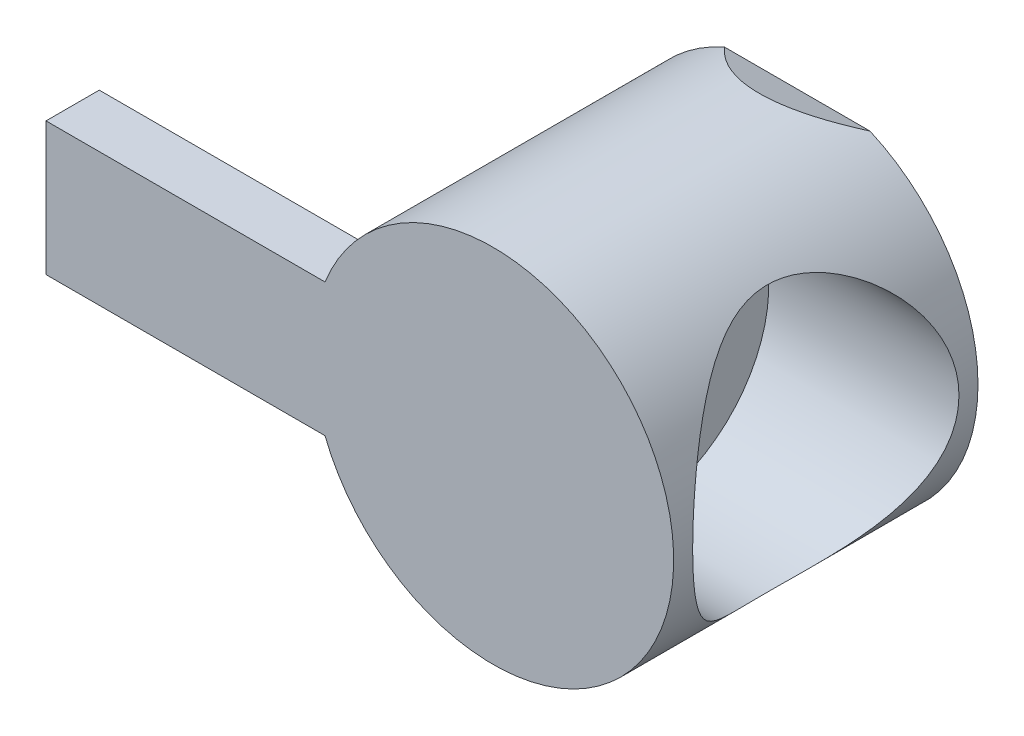
ISO-10303-21;
HEADER;
FILE_DESCRIPTION(('STEP AP214'),'2;1');
FILE_NAME('part.step','',(''),(''),'','','');
FILE_SCHEMA(('AUTOMOTIVE_DESIGN { 1 0 10303 214 1 1 1 1 }'));
ENDSEC;
DATA;
#1=APPLICATION_CONTEXT('core data for automotive mechanical design processes');
#2=APPLICATION_PROTOCOL_DEFINITION('international standard','automotive_design',2000,#1);
#3=PRODUCT_CONTEXT('',#1,'mechanical');
#4=PRODUCT('Part','Part','',(#3));
#5=PRODUCT_RELATED_PRODUCT_CATEGORY('part','',(#4));
#6=PRODUCT_DEFINITION_FORMATION('','',#4);
#7=PRODUCT_DEFINITION_CONTEXT('part definition',#1,'design');
#8=PRODUCT_DEFINITION('design','',#6,#7);
#9=PRODUCT_DEFINITION_SHAPE('','',#8);
#10=(LENGTH_UNIT() NAMED_UNIT(*) SI_UNIT(.MILLI.,.METRE.));
#11=(NAMED_UNIT(*) PLANE_ANGLE_UNIT() SI_UNIT($,.RADIAN.));
#12=(NAMED_UNIT(*) SI_UNIT($,.STERADIAN.) SOLID_ANGLE_UNIT());
#13=UNCERTAINTY_MEASURE_WITH_UNIT(LENGTH_MEASURE(1.E-05),#10,'distance_accuracy_value','');
#14=(GEOMETRIC_REPRESENTATION_CONTEXT(3) GLOBAL_UNCERTAINTY_ASSIGNED_CONTEXT((#13)) GLOBAL_UNIT_ASSIGNED_CONTEXT((#10,
#11,#12)) REPRESENTATION_CONTEXT('',''));
#15=CARTESIAN_POINT('',(0.,0.,0.));
#16=DIRECTION('',(0.,0.,1.));
#17=DIRECTION('',(1.,0.,0.));
#18=AXIS2_PLACEMENT_3D('',#15,#16,#17);
#19=CARTESIAN_POINT('',(-23.5,0.,-1.40000000000001));
#20=DIRECTION('',(-1.,0.,0.));
#21=DIRECTION('',(0.,0.,1.));
#22=AXIS2_PLACEMENT_3D('',#19,#20,#21);
#23=PLANE('',#22);
#24=DIRECTION('',(0.,0.,-1.));
#25=VECTOR('',#24,1.);
#26=CARTESIAN_POINT('',(-23.5,-3.5,0.));
#27=LINE('',#26,#25);
#28=CARTESIAN_POINT('',(-23.5,-3.5,0.));
#29=VERTEX_POINT('',#28);
#30=CARTESIAN_POINT('',(-23.5,-3.5,-2.80000000000001));
#31=VERTEX_POINT('',#30);
#32=EDGE_CURVE('E74',#29,#31,#27,.T.);
#33=ORIENTED_EDGE('',*,*,#32,.F.);
#34=DIRECTION('',(0.,1.,0.));
#35=VECTOR('',#34,1.);
#36=CARTESIAN_POINT('',(-23.5,0.,0.));
#37=LINE('',#36,#35);
#38=CARTESIAN_POINT('',(-23.5,3.5,0.));
#39=VERTEX_POINT('',#38);
#40=EDGE_CURVE('E70',#39,#29,#37,.F.);
#41=ORIENTED_EDGE('',*,*,#40,.F.);
#42=DIRECTION('',(0.,0.,1.));
#43=VECTOR('',#42,1.);
#44=CARTESIAN_POINT('',(-23.5,3.5,0.));
#45=LINE('',#44,#43);
#46=CARTESIAN_POINT('',(-23.5,3.5,-2.8));
#47=VERTEX_POINT('',#46);
#48=EDGE_CURVE('E118',#47,#39,#45,.T.);
#49=ORIENTED_EDGE('',*,*,#48,.F.);
#50=DIRECTION('',(0.,1.,0.));
#51=VECTOR('',#50,1.);
#52=CARTESIAN_POINT('',(-23.5,3.5,-2.8));
#53=LINE('',#52,#51);
#54=EDGE_CURVE('E109',#31,#47,#53,.T.);
#55=ORIENTED_EDGE('',*,*,#54,.F.);
#56=EDGE_LOOP('',(#33,#41,#49,#55));
#57=FACE_BOUND('',#56,.T.);
#58=ADVANCED_FACE('F16',(#57),#23,.T.);
#59=CARTESIAN_POINT('',(-0.499999999999997,-7.,-8.));
#60=DIRECTION('',(1.,0.,0.));
#61=DIRECTION('',(0.,0.,-1.));
#62=AXIS2_PLACEMENT_3D('',#59,#60,#61);
#63=PLANE('',#62);
#64=CARTESIAN_POINT('',(-0.499999999999997,0.,-8.));
#65=DIRECTION('',(-1.,0.,0.));
#66=DIRECTION('',(0.,0.,1.));
#67=AXIS2_PLACEMENT_3D('',#64,#65,#66);
#68=CIRCLE('',#67,4.);
#69=CARTESIAN_POINT('',(-0.499999999999997,0.,-4.));
#70=VERTEX_POINT('',#69);
#71=EDGE_CURVE('E89',#70,#70,#68,.F.);
#72=ORIENTED_EDGE('',*,*,#71,.F.);
#73=EDGE_LOOP('',(#72));
#74=FACE_BOUND('',#73,.T.);
#75=CARTESIAN_POINT('',(-0.499999999999997,0.,-8.));
#76=DIRECTION('',(-1.,0.,0.));
#77=DIRECTION('',(0.,0.,1.));
#78=AXIS2_PLACEMENT_3D('',#75,#76,#77);
#79=CIRCLE('',#78,7.);
#80=CARTESIAN_POINT('',(-0.499999999999997,0.,-0.999999999999996));
#81=VERTEX_POINT('',#80);
#82=EDGE_CURVE('E19',#81,#81,#79,.T.);
#83=ORIENTED_EDGE('',*,*,#82,.F.);
#84=EDGE_LOOP('',(#83));
#85=FACE_BOUND('',#84,.T.);
#86=ADVANCED_FACE('F181',(#74,#85),#63,.T.);
#87=CARTESIAN_POINT('',(-7.5,3.5,0.));
#88=DIRECTION('',(0.,1.,0.));
#89=DIRECTION('',(0.,0.,1.));
#90=AXIS2_PLACEMENT_3D('',#87,#88,#89);
#91=PLANE('',#90);
#92=ORIENTED_EDGE('',*,*,#48,.T.);
#93=DIRECTION('',(1.,0.,0.));
#94=VECTOR('',#93,1.);
#95=CARTESIAN_POINT('',(0.,3.5,0.));
#96=LINE('',#95,#94);
#97=CARTESIAN_POINT('',(-8.83176086632785,3.5,0.));
#98=VERTEX_POINT('',#97);
#99=EDGE_CURVE('E56',#98,#39,#96,.F.);
#100=ORIENTED_EDGE('',*,*,#99,.F.);
#101=DIRECTION('',(0.,0.,-1.));
#102=VECTOR('',#101,1.);
#103=CARTESIAN_POINT('',(-8.83176086632785,3.5,0.));
#104=LINE('',#103,#102);
#105=CARTESIAN_POINT('',(-8.83176086632785,3.5,-2.8));
#106=VERTEX_POINT('',#105);
#107=EDGE_CURVE('E87',#106,#98,#104,.F.);
#108=ORIENTED_EDGE('',*,*,#107,.F.);
#109=DIRECTION('',(-1.,0.,0.));
#110=VECTOR('',#109,1.);
#111=CARTESIAN_POINT('',(-7.5,3.5,-2.8));
#112=LINE('',#111,#110);
#113=EDGE_CURVE('E104',#47,#106,#112,.F.);
#114=ORIENTED_EDGE('',*,*,#113,.F.);
#115=EDGE_LOOP('',(#92,#100,#108,#114));
#116=FACE_BOUND('',#115,.T.);
#117=ADVANCED_FACE('F174',(#116),#91,.T.);
#118=CARTESIAN_POINT('',(0.,0.,0.));
#119=DIRECTION('',(0.,0.,1.));
#120=DIRECTION('',(1.,0.,0.));
#121=AXIS2_PLACEMENT_3D('',#118,#119,#120);
#122=PLANE('',#121);
#123=ORIENTED_EDGE('',*,*,#40,.T.);
#124=DIRECTION('',(1.,0.,0.));
#125=VECTOR('',#124,1.);
#126=CARTESIAN_POINT('',(-21.5,-3.5,0.));
#127=LINE('',#126,#125);
#128=CARTESIAN_POINT('',(-8.83176086632785,-3.5,0.));
#129=VERTEX_POINT('',#128);
#130=EDGE_CURVE('E62',#129,#29,#127,.F.);
#131=ORIENTED_EDGE('',*,*,#130,.F.);
#132=CARTESIAN_POINT('',(0.,0.,0.));
#133=DIRECTION('',(0.,0.,-1.));
#134=DIRECTION('',(-1.,0.,0.));
#135=AXIS2_PLACEMENT_3D('',#132,#133,#134);
#136=CIRCLE('',#135,9.5);
#137=EDGE_CURVE('E66',#98,#129,#136,.T.);
#138=ORIENTED_EDGE('',*,*,#137,.F.);
#139=ORIENTED_EDGE('',*,*,#99,.T.);
#140=EDGE_LOOP('',(#123,#131,#138,#139));
#141=FACE_BOUND('',#140,.T.);
#142=ADVANCED_FACE('F64',(#141),#122,.T.);
#143=CARTESIAN_POINT('',(-21.5,-3.5,0.));
#144=DIRECTION('',(0.,-1.,0.));
#145=DIRECTION('',(0.,0.,-1.));
#146=AXIS2_PLACEMENT_3D('',#143,#144,#145);
#147=PLANE('',#146);
#148=ORIENTED_EDGE('',*,*,#32,.T.);
#149=DIRECTION('',(-1.,0.,0.));
#150=VECTOR('',#149,1.);
#151=CARTESIAN_POINT('',(-7.5,-3.5,-2.8));
#152=LINE('',#151,#150);
#153=CARTESIAN_POINT('',(-8.83176086632785,-3.5,-2.8));
#154=VERTEX_POINT('',#153);
#155=EDGE_CURVE('E80',#154,#31,#152,.T.);
#156=ORIENTED_EDGE('',*,*,#155,.F.);
#157=DIRECTION('',(0.,0.,-1.));
#158=VECTOR('',#157,1.);
#159=CARTESIAN_POINT('',(-8.83176086632785,-3.5,0.));
#160=LINE('',#159,#158);
#161=EDGE_CURVE('E77',#129,#154,#160,.T.);
#162=ORIENTED_EDGE('',*,*,#161,.F.);
#163=ORIENTED_EDGE('',*,*,#130,.T.);
#164=EDGE_LOOP('',(#148,#156,#162,#163));
#165=FACE_BOUND('',#164,.T.);
#166=ADVANCED_FACE('F78',(#165),#147,.T.);
#167=CARTESIAN_POINT('',(-7.5,3.5,-2.8));
#168=DIRECTION('',(0.,0.,-1.));
#169=DIRECTION('',(-1.,0.,0.));
#170=AXIS2_PLACEMENT_3D('',#167,#168,#169);
#171=PLANE('',#170);
#172=ORIENTED_EDGE('',*,*,#54,.T.);
#173=ORIENTED_EDGE('',*,*,#113,.T.);
#174=CARTESIAN_POINT('',(0.,0.,-2.8));
#175=DIRECTION('',(0.,0.,-1.));
#176=DIRECTION('',(-1.,0.,0.));
#177=AXIS2_PLACEMENT_3D('',#174,#175,#176);
#178=CIRCLE('',#177,9.5);
#179=EDGE_CURVE('E84',#154,#106,#178,.T.);
#180=ORIENTED_EDGE('',*,*,#179,.F.);
#181=ORIENTED_EDGE('',*,*,#155,.T.);
#182=EDGE_LOOP('',(#172,#173,#180,#181));
#183=FACE_BOUND('',#182,.T.);
#184=ADVANCED_FACE('F170',(#183),#171,.T.);
#185=CARTESIAN_POINT('',(0.,-9.0983408237649,-15.));
#186=DIRECTION('',(0.,-0.92794483738581,-0.372717558975992));
#187=DIRECTION('',(0.,0.372717558975992,-0.92794483738581));
#188=AXIS2_PLACEMENT_3D('',#185,#186,#187);
#189=PLANE('',#188);
#190=CARTESIAN_POINT('',(0.,0.,-37.6518933515901));
#191=DIRECTION('',(0.,-0.92794483738581,-0.372717558975992));
#192=DIRECTION('',(0.,0.372717558975992,-0.92794483738581));
#193=AXIS2_PLACEMENT_3D('',#190,#191,#192);
#194=ELLIPSE('',#193,25.4884691402798,9.5);
#195=CARTESIAN_POINT('',(-3.82331378800098,-8.6966816475298,-16.));
#196=VERTEX_POINT('',#195);
#197=CARTESIAN_POINT('',(3.82331378800098,-8.6966816475298,-16.));
#198=VERTEX_POINT('',#197);
#199=EDGE_CURVE('E167',#196,#198,#194,.F.);
#200=ORIENTED_EDGE('',*,*,#199,.F.);
#201=DIRECTION('',(-1.,0.,0.));
#202=VECTOR('',#201,1.);
#203=CARTESIAN_POINT('',(9.50000000000001,-8.6966816475298,-16.));
#204=LINE('',#203,#202);
#205=EDGE_CURVE('E99',#198,#196,#204,.T.);
#206=ORIENTED_EDGE('',*,*,#205,.F.);
#207=EDGE_LOOP('',(#200,#206));
#208=FACE_BOUND('',#207,.T.);
#209=ADVANCED_FACE('F198',(#208),#189,.T.);
#210=CARTESIAN_POINT('',(-0.108255951926131,7.61675230686671,-18.6886709044859));
#211=DIRECTION('',(0.,0.92794483738581,-0.372717558975992));
#212=DIRECTION('',(0.,0.372717558975992,0.92794483738581));
#213=AXIS2_PLACEMENT_3D('',#210,#211,#212);
#214=PLANE('',#213);
#215=CARTESIAN_POINT('',(0.,0.,-37.6518933515902));
#216=DIRECTION('',(0.,0.92794483738581,-0.372717558975992));
#217=DIRECTION('',(0.,-0.372717558975992,-0.92794483738581));
#218=AXIS2_PLACEMENT_3D('',#215,#216,#217);
#219=ELLIPSE('',#218,25.4884691402798,9.5);
#220=CARTESIAN_POINT('',(3.82331378800099,8.6966816475298,-16.));
#221=VERTEX_POINT('',#220);
#222=CARTESIAN_POINT('',(-3.82331378800098,8.6966816475298,-16.));
#223=VERTEX_POINT('',#222);
#224=EDGE_CURVE('E162',#221,#223,#219,.F.);
#225=ORIENTED_EDGE('',*,*,#224,.F.);
#226=DIRECTION('',(-1.,0.,0.));
#227=VECTOR('',#226,1.);
#228=CARTESIAN_POINT('',(9.50000000000001,8.6966816475298,-16.));
#229=LINE('',#228,#227);
#230=EDGE_CURVE('E33',#223,#221,#229,.F.);
#231=ORIENTED_EDGE('',*,*,#230,.F.);
#232=EDGE_LOOP('',(#225,#231));
#233=FACE_BOUND('',#232,.T.);
#234=ADVANCED_FACE('F201',(#233),#214,.T.);
#235=CARTESIAN_POINT('',(9.50000000000001,0.,-16.));
#236=DIRECTION('',(0.,0.,-1.));
#237=DIRECTION('',(-1.,0.,0.));
#238=AXIS2_PLACEMENT_3D('',#235,#236,#237);
#239=PLANE('',#238);
#240=ORIENTED_EDGE('',*,*,#230,.T.);
#241=CARTESIAN_POINT('',(0.,0.,-16.));
#242=DIRECTION('',(0.,0.,-1.));
#243=DIRECTION('',(-1.,0.,0.));
#244=AXIS2_PLACEMENT_3D('',#241,#242,#243);
#245=CIRCLE('',#244,9.5);
#246=EDGE_CURVE('E165',#198,#221,#245,.F.);
#247=ORIENTED_EDGE('',*,*,#246,.F.);
#248=ORIENTED_EDGE('',*,*,#205,.T.);
#249=CARTESIAN_POINT('',(0.,0.,-16.));
#250=DIRECTION('',(0.,0.,-1.));
#251=DIRECTION('',(-1.,0.,0.));
#252=AXIS2_PLACEMENT_3D('',#249,#250,#251);
#253=CIRCLE('',#252,9.5);
#254=EDGE_CURVE('E164',#223,#196,#253,.F.);
#255=ORIENTED_EDGE('',*,*,#254,.F.);
#256=EDGE_LOOP('',(#240,#247,#248,#255));
#257=FACE_BOUND('',#256,.T.);
#258=ADVANCED_FACE('F205',(#257),#239,.T.);
#259=CARTESIAN_POINT('',(9.50000000000001,0.,-8.));
#260=DIRECTION('',(-1.,0.,0.));
#261=DIRECTION('',(0.,0.,1.));
#262=AXIS2_PLACEMENT_3D('',#259,#260,#261);
#263=CYLINDRICAL_SURFACE('',#262,7.);
#264=ORIENTED_EDGE('',*,*,#82,.T.);
#265=EDGE_LOOP('',(#264));
#266=FACE_BOUND('',#265,.T.);
#267=CARTESIAN_POINT('',(9.5,0.,-15.));
#268=CARTESIAN_POINT('',(9.49999955541205,-0.171776685952553,-14.9999995379097));
#269=CARTESIAN_POINT('',(9.49533098908795,-0.343560225193648,-14.9936674467285));
#270=CARTESIAN_POINT('',(9.47676656087095,-0.685767013978319,-14.9684414714967));
#271=CARTESIAN_POINT('',(9.46286666358579,-0.856189635622143,-14.9495420937666));
#272=CARTESIAN_POINT('',(9.42614477075101,-1.19448027730661,-14.8994561720474));
#273=CARTESIAN_POINT('',(9.40331045412692,-1.36234443550678,-14.8682526594889));
#274=CARTESIAN_POINT('',(9.34923642147448,-1.69412177418581,-14.7940317146752));
#275=CARTESIAN_POINT('',(9.31799303174897,-1.85803319363687,-14.7510091188109));
#276=CARTESIAN_POINT('',(9.24799919952023,-2.17977978031129,-14.6540670672471));
#277=CARTESIAN_POINT('',(9.20929698937563,-2.33764656863681,-14.6002175319022));
#278=CARTESIAN_POINT('',(9.12502997386116,-2.64757708116554,-14.4821196135556));
#279=CARTESIAN_POINT('',(9.07946246255211,-2.79963848744044,-14.4178671295121));
#280=CARTESIAN_POINT('',(8.93375835423318,-3.24586369811695,-14.2106167564135));
#281=CARTESIAN_POINT('',(8.82453680001396,-3.53043821689032,-14.0530124893339));
#282=CARTESIAN_POINT('',(8.57825760516843,-4.09475115131068,-13.6882565565468));
#283=CARTESIAN_POINT('',(8.43956658164152,-4.37165864095569,-13.4778886648323));
#284=CARTESIAN_POINT('',(8.15091482841139,-4.88879093732242,-13.0218291370732));
#285=CARTESIAN_POINT('',(8.00093707508744,-5.12895860571657,-12.7760836103484));
#286=CARTESIAN_POINT('',(7.76049967158025,-5.48181424616637,-12.3579415308006));
#287=CARTESIAN_POINT('',(7.67032010942563,-5.60696990323276,-12.1957098019707));
#288=CARTESIAN_POINT('',(7.49198173465386,-5.84312192087893,-11.8600581456795));
#289=CARTESIAN_POINT('',(7.40382351786428,-5.95411414945518,-11.6866349753719));
#290=CARTESIAN_POINT('',(7.23242362575897,-6.16117658422522,-11.3290425066135));
#291=CARTESIAN_POINT('',(7.14917671636972,-6.25726286073934,-11.1448850798921));
#292=CARTESIAN_POINT('',(6.99079488630454,-6.43372619017791,-10.7660198309281));
#293=CARTESIAN_POINT('',(6.91565541664659,-6.51411207312527,-10.5713180180921));
#294=CARTESIAN_POINT('',(6.75445495057007,-6.68168937246028,-10.1058150140408));
#295=CARTESIAN_POINT('',(6.67288937491812,-6.7624720984525,-9.83099179050707));
#296=CARTESIAN_POINT('',(6.57371545179302,-6.85845271679183,-9.40803028557168));
#297=CARTESIAN_POINT('',(6.54452964476944,-6.88623891682234,-9.26533732895986));
#298=CARTESIAN_POINT('',(6.49495803127038,-6.93301436118631,-8.97703616186756));
#299=CARTESIAN_POINT('',(6.47456778607314,-6.95200804306041,-8.83142946073562));
#300=CARTESIAN_POINT('',(6.44335448167087,-6.98094872877254,-8.53704310231851));
#301=CARTESIAN_POINT('',(6.43261322697401,-6.99081839898816,-8.38824706610708));
#302=CARTESIAN_POINT('',(6.42151697724789,-7.00101267212038,-8.08994042638532));
#303=CARTESIAN_POINT('',(6.42116154926355,-7.00133767292664,-7.94042985292186));
#304=CARTESIAN_POINT('',(6.43085789106656,-6.99243223741762,-7.64195345069195));
#305=CARTESIAN_POINT('',(6.4409155034946,-6.98319643664374,-7.49298797486146));
#306=CARTESIAN_POINT('',(6.47094998819331,-6.95537341601778,-7.19694696395328));
#307=CARTESIAN_POINT('',(6.49092795496829,-6.9367851643147,-7.04987163925158));
#308=CARTESIAN_POINT('',(6.54244989420852,-6.8882310628938,-6.74351062107689));
#309=CARTESIAN_POINT('',(6.57498150538566,-6.85728212605807,-6.58454794134433));
#310=CARTESIAN_POINT('',(6.64948330997911,-6.78506116073618,-6.27117635874643));
#311=CARTESIAN_POINT('',(6.69145981128797,-6.74378223115349,-6.11677057758291));
#312=CARTESIAN_POINT('',(6.78322056918064,-6.65147770047985,-5.81297003630694));
#313=CARTESIAN_POINT('',(6.83301948543713,-6.60043375922959,-5.66358533732154));
#314=CARTESIAN_POINT('',(6.93868686353358,-6.48926082247947,-5.37054155145404));
#315=CARTESIAN_POINT('',(6.9945537026046,-6.42913425431028,-5.22688094773313));
#316=CARTESIAN_POINT('',(7.13163878833073,-6.27722782732685,-4.8950727394109));
#317=CARTESIAN_POINT('',(7.21478130229932,-6.18181548157259,-4.70937668568039));
#318=CARTESIAN_POINT('',(7.38614645460775,-5.97601774061044,-4.34893105987983));
#319=CARTESIAN_POINT('',(7.47437077848852,-5.86562736082084,-4.17418516036361));
#320=CARTESIAN_POINT('',(7.65314642626286,-5.63038165286863,-3.83570991029862));
#321=CARTESIAN_POINT('',(7.74369983406161,-5.50551299348858,-3.67199093583184));
#322=CARTESIAN_POINT('',(7.92457711931574,-5.24181678255556,-3.35611390836703));
#323=CARTESIAN_POINT('',(8.0149010226231,-5.10299088178997,-3.20395449189532));
#324=CARTESIAN_POINT('',(8.19443723561548,-4.80949416448075,-2.9095572750946));
#325=CARTESIAN_POINT('',(8.28361271965059,-4.6546174339426,-2.76750188573861));
#326=CARTESIAN_POINT('',(8.45726031506847,-4.33110290650534,-2.49672473915292));
#327=CARTESIAN_POINT('',(8.54173188426548,-4.16246352878738,-2.36800451750505));
#328=CARTESIAN_POINT('',(8.70369281598265,-3.81220430302919,-2.12527253028348));
#329=CARTESIAN_POINT('',(8.7811932512488,-3.63060589217282,-2.01123731048931));
#330=CARTESIAN_POINT('',(8.92724463591068,-3.25497524730534,-1.7990632508854));
#331=CARTESIAN_POINT('',(8.99579918023937,-3.06094805485953,-1.7009180217954));
#332=CARTESIAN_POINT('',(9.10583426828904,-2.71258675994345,-1.54489046885185));
#333=CARTESIAN_POINT('',(9.14976026757035,-2.56075245849196,-1.48312381115819));
#334=CARTESIAN_POINT('',(9.23072281936376,-2.25150704185519,-1.36993135333547));
#335=CARTESIAN_POINT('',(9.26776091235204,-2.09409718303787,-1.31850324078802));
#336=CARTESIAN_POINT('',(9.33415539124307,-1.77484452477982,-1.22670987236036));
#337=CARTESIAN_POINT('',(9.36352686759235,-1.61301113703341,-1.18632287635896));
#338=CARTESIAN_POINT('',(9.41405304054827,-1.28569422979342,-1.11705318904569));
#339=CARTESIAN_POINT('',(9.43521098910392,-1.12021218237982,-1.08816594456784));
#340=CARTESIAN_POINT('',(9.46790733508565,-0.796087809469865,-1.04360117423619));
#341=CARTESIAN_POINT('',(9.4799187532499,-0.637582505338162,-1.02727356284332));
#342=CARTESIAN_POINT('',(9.49596619231267,-0.319386948066158,-1.00547153625326));
#343=CARTESIAN_POINT('',(9.50000041332216,-0.15969643566463,-0.999999570406321));
#344=CARTESIAN_POINT('',(9.49999955541205,0.171776685952554,-1.00000046209032));
#345=CARTESIAN_POINT('',(9.49533098908795,0.343560225193649,-1.00633255327146));
#346=CARTESIAN_POINT('',(9.47676656087095,0.685767013978319,-1.03155852850331));
#347=CARTESIAN_POINT('',(9.46286666358579,0.856189635622142,-1.05045790623339));
#348=CARTESIAN_POINT('',(9.42614477075101,1.19448027730661,-1.10054382795259));
#349=CARTESIAN_POINT('',(9.40331045412692,1.36234443550678,-1.13174734051107));
#350=CARTESIAN_POINT('',(9.34923642147448,1.69412177418581,-1.20596828532482));
#351=CARTESIAN_POINT('',(9.31799303174897,1.85803319363687,-1.24899088118914));
#352=CARTESIAN_POINT('',(9.24799919952023,2.17977978031129,-1.34593293275293));
#353=CARTESIAN_POINT('',(9.20929698937563,2.33764656863681,-1.39978246809779));
#354=CARTESIAN_POINT('',(9.12502997386116,2.64757708116554,-1.51788038644444));
#355=CARTESIAN_POINT('',(9.07946246255211,2.79963848744045,-1.58213287048791));
#356=CARTESIAN_POINT('',(8.93375835423318,3.24586369811696,-1.78938324358651));
#357=CARTESIAN_POINT('',(8.82453680001396,3.53043821689032,-1.94698751066605));
#358=CARTESIAN_POINT('',(8.57825760516843,4.09475115131068,-2.31174344345321));
#359=CARTESIAN_POINT('',(8.43956658164152,4.37165864095569,-2.52211133516767));
#360=CARTESIAN_POINT('',(8.15091482841139,4.88879093732242,-2.97817086292678));
#361=CARTESIAN_POINT('',(8.00093707508744,5.12895860571657,-3.22391638965163));
#362=CARTESIAN_POINT('',(7.76049967158025,5.48181424616637,-3.64205846919939));
#363=CARTESIAN_POINT('',(7.67032010942563,5.60696990323276,-3.80429019802929));
#364=CARTESIAN_POINT('',(7.49198173465386,5.84312192087893,-4.13994185432051));
#365=CARTESIAN_POINT('',(7.40382351786428,5.95411414945518,-4.31336502462811));
#366=CARTESIAN_POINT('',(7.23242362575897,6.16117658422522,-4.6709574933865));
#367=CARTESIAN_POINT('',(7.14917671636972,6.25726286073933,-4.85511492010789));
#368=CARTESIAN_POINT('',(6.99079488630454,6.43372619017791,-5.23398016907187));
#369=CARTESIAN_POINT('',(6.91565541664659,6.51411207312527,-5.42868198190792));
#370=CARTESIAN_POINT('',(6.75445495057007,6.68168937246028,-5.89418498595919));
#371=CARTESIAN_POINT('',(6.67288937491812,6.7624720984525,-6.16900820949293));
#372=CARTESIAN_POINT('',(6.57371545179302,6.85845271679183,-6.59196971442833));
#373=CARTESIAN_POINT('',(6.54452964476944,6.88623891682234,-6.73466267104014));
#374=CARTESIAN_POINT('',(6.49495803127038,6.93301436118631,-7.02296383813244));
#375=CARTESIAN_POINT('',(6.47456778607314,6.95200804306041,-7.16857053926438));
#376=CARTESIAN_POINT('',(6.44335448167088,6.98094872877254,-7.46295689768149));
#377=CARTESIAN_POINT('',(6.43261322697401,6.99081839898816,-7.61175293389292));
#378=CARTESIAN_POINT('',(6.42151697724789,7.00101267212038,-7.91005957361468));
#379=CARTESIAN_POINT('',(6.42116154926355,7.00133767292664,-8.05957014707814));
#380=CARTESIAN_POINT('',(6.43085789106656,6.99243223741762,-8.35804654930805));
#381=CARTESIAN_POINT('',(6.4409155034946,6.98319643664374,-8.50701202513853));
#382=CARTESIAN_POINT('',(6.47094998819332,6.95537341601778,-8.80305303604672));
#383=CARTESIAN_POINT('',(6.49092795496829,6.9367851643147,-8.95012836074842));
#384=CARTESIAN_POINT('',(6.54244989420852,6.8882310628938,-9.25648937892311));
#385=CARTESIAN_POINT('',(6.57498150538566,6.85728212605807,-9.41545205865567));
#386=CARTESIAN_POINT('',(6.64948330997911,6.78506116073618,-9.72882364125357));
#387=CARTESIAN_POINT('',(6.69145981128797,6.74378223115349,-9.8832294224171));
#388=CARTESIAN_POINT('',(6.78322056918064,6.65147770047984,-10.1870299636931));
#389=CARTESIAN_POINT('',(6.83301948543713,6.60043375922959,-10.3364146626785));
#390=CARTESIAN_POINT('',(6.93868686353358,6.48926082247947,-10.629458448546));
#391=CARTESIAN_POINT('',(6.9945537026046,6.42913425431028,-10.7731190522669));
#392=CARTESIAN_POINT('',(7.13163878833073,6.27722782732685,-11.1049272605891));
#393=CARTESIAN_POINT('',(7.21478130229932,6.18181548157258,-11.2906233143196));
#394=CARTESIAN_POINT('',(7.38614645460775,5.97601774061043,-11.6510689401202));
#395=CARTESIAN_POINT('',(7.47437077848852,5.86562736082084,-11.8258148396364));
#396=CARTESIAN_POINT('',(7.65314642626286,5.63038165286862,-12.1642900897014));
#397=CARTESIAN_POINT('',(7.74369983406161,5.50551299348857,-12.3280090641682));
#398=CARTESIAN_POINT('',(7.92457711931575,5.24181678255555,-12.643886091633));
#399=CARTESIAN_POINT('',(8.01490102262311,5.10299088178996,-12.7960455081047));
#400=CARTESIAN_POINT('',(8.19443723561549,4.80949416448074,-13.0904427249054));
#401=CARTESIAN_POINT('',(8.2836127196506,4.65461743394259,-13.2324981142614));
#402=CARTESIAN_POINT('',(8.45726031506847,4.33110290650532,-13.5032752608471));
#403=CARTESIAN_POINT('',(8.54173188426548,4.16246352878737,-13.631995482495));
#404=CARTESIAN_POINT('',(8.70369281598266,3.81220430302918,-13.8747274697165));
#405=CARTESIAN_POINT('',(8.78119325124881,3.6306058921728,-13.9887626895107));
#406=CARTESIAN_POINT('',(8.92724463591069,3.25497524730533,-14.2009367491146));
#407=CARTESIAN_POINT('',(8.99579918023937,3.06094805485951,-14.2990819782046));
#408=CARTESIAN_POINT('',(9.10583426828904,2.71258675994344,-14.4551095311482));
#409=CARTESIAN_POINT('',(9.14976026757035,2.56075245849195,-14.5168761888418));
#410=CARTESIAN_POINT('',(9.23072281936377,2.25150704185518,-14.6300686466645));
#411=CARTESIAN_POINT('',(9.26776091235204,2.09409718303786,-14.681496759212));
#412=CARTESIAN_POINT('',(9.33415539124308,1.7748445247798,-14.7732901276396));
#413=CARTESIAN_POINT('',(9.36352686759235,1.6130111370334,-14.813677123641));
#414=CARTESIAN_POINT('',(9.41405304054827,1.2856942297934,-14.8829468109543));
#415=CARTESIAN_POINT('',(9.43521098910392,1.12021218237981,-14.9118340554322));
#416=CARTESIAN_POINT('',(9.46790733508566,0.796087809469852,-14.9563988257638));
#417=CARTESIAN_POINT('',(9.47991875324991,0.637582505338151,-14.9727264371567));
#418=CARTESIAN_POINT('',(9.49596619231267,0.319386948066152,-14.9945284637467));
#419=CARTESIAN_POINT('',(9.50000041332216,0.159696435664627,-15.0000004295937));
#420=CARTESIAN_POINT('',(9.5,0.,-15.));
#421=B_SPLINE_CURVE_WITH_KNOTS('',3,(#267,#268,#269,#270,#271,#272,#273,#274,#275,#276,#277,
#278,#279,#280,#281,#282,#283,#284,#285,#286,#287,#288,#289,#290,#291,#292,#293,#294,#295,#296,
#297,#298,#299,#300,#301,#302,#303,#304,#305,#306,#307,#308,#309,#310,#311,#312,#313,#314,#315,
#316,#317,#318,#319,#320,#321,#322,#323,#324,#325,#326,#327,#328,#329,#330,#331,#332,#333,#334,
#335,#336,#337,#338,#339,#340,#341,#342,#343,#344,#345,#346,#347,#348,#349,#350,#351,#352,#353,
#354,#355,#356,#357,#358,#359,#360,#361,#362,#363,#364,#365,#366,#367,#368,#369,#370,#371,#372,
#373,#374,#375,#376,#377,#378,#379,#380,#381,#382,#383,#384,#385,#386,#387,#388,#389,#390,#391,
#392,#393,#394,#395,#396,#397,#398,#399,#400,#401,#402,#403,#404,#405,#406,#407,#408,#409,#410,
#411,#412,#413,#414,#415,#416,#417,#418,#419,#420),.UNSPECIFIED.,.T.,.F.,(4,2,2,2,2,2,2,2,2,2,2,
2,2,2,2,2,2,2,2,2,2,2,2,2,2,2,2,2,2,2,2,2,2,2,2,2,2,2,2,2,2,2,2,2,2,2,2,2,2,2,2,2,2,2,2,2,2,2,2,
2,2,2,2,2,2,2,2,2,2,2,2,2,2,2,2,2,4),(0.,0.515163605013197,1.03055255746482,1.54665478009514,
2.06298284087337,2.57607778227243,3.08937549024409,4.11479706697071,5.23415084878313,
6.35522814561899,7.02619557357636,7.69735830255475,8.36779233588973,9.0378482192703,
9.92757547003859,10.3719471634058,10.816094339396,11.2639724148655,11.7118318195669,
12.1599426494335,12.6081029299775,13.1029236514249,13.598075831437,14.0941672774528,
14.5901263768995,15.2633476684878,15.9367935553124,16.6108645327088,17.2848558782,
17.9689268779854,18.6530765631033,19.3361196330275,20.0188873691962,20.527492653794,
21.0359840519631,21.5434668912918,22.0507485995579,22.5295751346067,23.0085096946056,
23.5236732996188,24.0390622520704,24.5551644747007,25.071492535479,25.584587476878,
26.0978851848497,27.1233067615763,28.2426605433887,29.3637378402246,30.034705268182,
30.7058679971604,31.3763020304953,32.0463579138759,32.9360851646442,33.3804568580114,
33.8246040340016,34.2724821094711,34.7203415141725,35.1684523440391,35.6166126245831,
36.1114333460305,36.6065855260426,37.1026769720584,37.5986360715051,38.2718573630933,
38.945303249918,39.6193742273144,40.2933655728056,40.977436572591,41.6615862577089,
42.3446293276331,43.0273970638018,43.5360023483996,44.0444937465687,44.5519765858974,
45.0592582941634,45.5380848292123,46.0170193892112),.UNSPECIFIED.);
#422=CARTESIAN_POINT('',(9.5,0.,-15.));
#423=VERTEX_POINT('',#422);
#424=EDGE_CURVE('E25',#423,#423,#421,.T.);
#425=ORIENTED_EDGE('',*,*,#424,.F.);
#426=EDGE_LOOP('',(#425));
#427=FACE_BOUND('',#426,.T.);
#428=ADVANCED_FACE('F152',(#266,#427),#263,.F.);
#429=CARTESIAN_POINT('',(9.50000000000001,0.,-8.));
#430=DIRECTION('',(-1.,0.,0.));
#431=DIRECTION('',(0.,0.,1.));
#432=AXIS2_PLACEMENT_3D('',#429,#430,#431);
#433=CYLINDRICAL_SURFACE('',#432,4.);
#434=CARTESIAN_POINT('',(-8.61684396980705,4.,-8.));
#435=CARTESIAN_POINT('',(-8.61684479291634,3.99999920365226,-7.89339588951191));
#436=CARTESIAN_POINT('',(-8.61882923618132,3.9957319358542,-7.78675494811101));
#437=CARTESIAN_POINT('',(-8.62670095753731,3.97870775218113,-7.57425234767577));
#438=CARTESIAN_POINT('',(-8.63259074890548,3.96594536927521,-7.46839123488566));
#439=CARTESIAN_POINT('',(-8.64809004641728,3.93203356564338,-7.25805909420674));
#440=CARTESIAN_POINT('',(-8.65770736697029,3.91086652305503,-7.15359146674129));
#441=CARTESIAN_POINT('',(-8.6803354198555,3.860379986894,-6.94700660151014));
#442=CARTESIAN_POINT('',(-8.69334758173029,3.8310570585935,-6.84489037366222));
#443=CARTESIAN_POINT('',(-8.73674622007323,3.7315599849548,-6.54402847681404));
#444=CARTESIAN_POINT('',(-8.77158383752974,3.64967476491844,-6.34965608494503));
#445=CARTESIAN_POINT('',(-8.8491231047003,3.45741232788934,-5.97756390364931));
#446=CARTESIAN_POINT('',(-8.8918230094151,3.34704143098506,-5.7998404322496));
#447=CARTESIAN_POINT('',(-8.98331887532201,3.09340545265793,-5.45455275976188));
#448=CARTESIAN_POINT('',(-9.0323243701199,2.94861066888091,-5.28816517116338));
#449=CARTESIAN_POINT('',(-9.12918799654512,2.63345602204265,-4.98116894420088));
#450=CARTESIAN_POINT('',(-9.17704567399664,2.46308622671577,-4.84057036855449));
#451=CARTESIAN_POINT('',(-9.26877681609602,2.09231676497945,-4.58307831936011));
#452=CARTESIAN_POINT('',(-9.31237856691952,1.89091878265369,-4.46751658857194));
#453=CARTESIAN_POINT('',(-9.38811444393872,1.4693730575349,-4.27242564263145));
#454=CARTESIAN_POINT('',(-9.42025376150082,1.24923385879032,-4.19288011123606));
#455=CARTESIAN_POINT('',(-9.46795722737466,0.808831057041757,-4.07636813025215));
#456=CARTESIAN_POINT('',(-9.48430966668667,0.589192572355979,-4.0373682087497));
#457=CARTESIAN_POINT('',(-9.50146415645256,0.145921296137905,-3.99647791119913));
#458=CARTESIAN_POINT('',(-9.50227265579288,-0.0777098003891295,-3.99457214548393));
#459=CARTESIAN_POINT('',(-9.48870803605992,-0.507809014322279,-4.02687201870989));
#460=CARTESIAN_POINT('',(-9.47527492001272,-0.714480298467526,-4.05884167427961));
#461=CARTESIAN_POINT('',(-9.43603370637273,-1.11920616443698,-4.15414388128753));
#462=CARTESIAN_POINT('',(-9.41022469558179,-1.31726010922456,-4.21747874712743));
#463=CARTESIAN_POINT('',(-9.34822412974687,-1.70277425779943,-4.37445787547147));
#464=CARTESIAN_POINT('',(-9.31187993215786,-1.89002630779711,-4.46855054659769));
#465=CARTESIAN_POINT('',(-9.23235185267789,-2.24657465770714,-4.68392928340789));
#466=CARTESIAN_POINT('',(-9.18916553920334,-2.4158645382903,-4.80522502303991));
#467=CARTESIAN_POINT('',(-9.09661565977341,-2.74459541942161,-5.08168462483474));
#468=CARTESIAN_POINT('',(-9.04703120212881,-2.90245769431404,-5.23865435362879));
#469=CARTESIAN_POINT('',(-8.94958496430327,-3.19030905144212,-5.57692731834381));
#470=CARTESIAN_POINT('',(-8.90172388368923,-3.32028691843321,-5.7582402977487));
#471=CARTESIAN_POINT('',(-8.81154640450858,-3.55285473738947,-6.14786429218683));
#472=CARTESIAN_POINT('',(-8.76947528387452,-3.65435735480679,-6.35688602183361));
#473=CARTESIAN_POINT('',(-8.69857730626177,-3.82007496880753,-6.79129673851623));
#474=CARTESIAN_POINT('',(-8.66974074928303,-3.88431728369774,-7.01667359763221));
#475=CARTESIAN_POINT('',(-8.63099704573982,-3.9696294380598,-7.46156479271675));
#476=CARTESIAN_POINT('',(-8.61996848160524,-3.993263518851,-7.68048795833547));
#477=CARTESIAN_POINT('',(-8.61488120321362,-4.0042333597211,-8.11940280460085));
#478=CARTESIAN_POINT('',(-8.62081640806785,-3.99158212674786,-8.33939407414844));
#479=CARTESIAN_POINT('',(-8.6478273255981,-3.93268182382048,-8.75889632288022));
#480=CARTESIAN_POINT('',(-8.66787813142854,-3.88870483169292,-8.9588008376862));
#481=CARTESIAN_POINT('',(-8.71954105498789,-3.77142924464059,-9.34822017288409));
#482=CARTESIAN_POINT('',(-8.75115591317121,-3.69812369903528,-9.53773251828346));
#483=CARTESIAN_POINT('',(-8.82403036683286,-3.52079864778837,-9.91005459670814));
#484=CARTESIAN_POINT('',(-8.86564471807188,-3.41559931118618,-10.0922307166274));
#485=CARTESIAN_POINT('',(-8.95333477001598,-3.17863832384833,-10.4372317288205));
#486=CARTESIAN_POINT('',(-8.99941242567044,-3.04686500598842,-10.6000480712313));
#487=CARTESIAN_POINT('',(-9.09547779348834,-2.74753739971471,-10.9158563249657));
#488=CARTESIAN_POINT('',(-9.14547084697947,-2.57791458120941,-11.0668938400701));
#489=CARTESIAN_POINT('',(-9.24017447014067,-2.21458437739197,-11.3387250785678));
#490=CARTESIAN_POINT('',(-9.28488460226699,-2.02087499989838,-11.4595162978189));
#491=CARTESIAN_POINT('',(-9.36431835055757,-1.61330019295804,-11.6673884327267));
#492=CARTESIAN_POINT('',(-9.39900758645444,-1.39936863834623,-11.7543536414871));
#493=CARTESIAN_POINT('',(-9.45417439015116,-0.958072669830156,-11.8904138875023));
#494=CARTESIAN_POINT('',(-9.47466061430599,-0.730716529714421,-11.9395319935891));
#495=CARTESIAN_POINT('',(-9.49809838044287,-0.286474708646805,-11.9955540562212));
#496=CARTESIAN_POINT('',(-9.50219336575512,-0.0699943441316092,-12.0052118342112));
#497=CARTESIAN_POINT('',(-9.49557132455836,0.361433502234719,-11.9894778549098));
#498=CARTESIAN_POINT('',(-9.48485699289538,0.576381255820816,-11.9640924744103));
#499=CARTESIAN_POINT('',(-9.45042765512476,0.990478887183232,-11.8809702440041));
#500=CARTESIAN_POINT('',(-9.42720553396715,1.18991903602096,-11.8244581828662));
#501=CARTESIAN_POINT('',(-9.37033345964986,1.57640122736063,-11.6820371517927));
#502=CARTESIAN_POINT('',(-9.33668154771202,1.76344093296737,-11.5961226595855));
#503=CARTESIAN_POINT('',(-9.26029827486539,2.12916899229196,-11.39298853587));
#504=CARTESIAN_POINT('',(-9.21722419643882,2.30709321191543,-11.2745252319797));
#505=CARTESIAN_POINT('',(-9.12707637364082,2.64130416869979,-11.0114403567207));
#506=CARTESIAN_POINT('',(-9.08000111072523,2.79758263107986,-10.8668088301755));
#507=CARTESIAN_POINT('',(-8.98302613378497,3.09539281084939,-10.5436497962606));
#508=CARTESIAN_POINT('',(-8.93315836548485,3.23513635037117,-10.3634619530357));
#509=CARTESIAN_POINT('',(-8.8395833506371,3.4827243199905,-9.98053941778491));
#510=CARTESIAN_POINT('',(-8.79587960200701,3.59055067575902,-9.77779203962441));
#511=CARTESIAN_POINT('',(-8.73925649151902,3.72528384389563,-9.46130104392929));
#512=CARTESIAN_POINT('',(-8.72188950229769,3.76565500657312,-9.35390602657863));
#513=CARTESIAN_POINT('',(-8.69068132310427,3.8371324591037,-9.13559648905499));
#514=CARTESIAN_POINT('',(-8.67683839911789,3.86824330676976,-9.02468373011599));
#515=CARTESIAN_POINT('',(-8.65322907030115,3.92077213220802,-8.80048435539644));
#516=CARTESIAN_POINT('',(-8.64345191765459,3.94221567817545,-8.6872048404949));
#517=CARTESIAN_POINT('',(-8.6283096637991,3.97524931223112,-8.45898369117751));
#518=CARTESIAN_POINT('',(-8.6229411498672,3.98684702220686,-8.34404341263164));
#519=CARTESIAN_POINT('',(-8.61886983716841,3.9956332562663,-8.19071734970768));
#520=CARTESIAN_POINT('',(-8.61811067228956,3.99727028618603,-8.15259801895599));
#521=CARTESIAN_POINT('',(-8.61709758836867,3.99945380687364,-8.07632069909991));
#522=CARTESIAN_POINT('',(-8.61684367514598,4.00000028508082,-8.03816270955532));
#523=CARTESIAN_POINT('',(-8.61684396980705,4.,-8.));
#524=B_SPLINE_CURVE_WITH_KNOTS('',3,(#434,#435,#436,#437,#438,#439,#440,#441,#442,#443,#444,
#445,#446,#447,#448,#449,#450,#451,#452,#453,#454,#455,#456,#457,#458,#459,#460,#461,#462,#463,
#464,#465,#466,#467,#468,#469,#470,#471,#472,#473,#474,#475,#476,#477,#478,#479,#480,#481,#482,
#483,#484,#485,#486,#487,#488,#489,#490,#491,#492,#493,#494,#495,#496,#497,#498,#499,#500,#501,
#502,#503,#504,#505,#506,#507,#508,#509,#510,#511,#512,#513,#514,#515,#516,#517,#518,#519,#520,
#521,#522,#523),.UNSPECIFIED.,.T.,.F.,(4,2,2,2,2,2,2,2,2,2,2,2,2,2,2,2,2,2,2,2,2,2,2,2,2,2,2,2,
2,2,2,2,2,2,2,2,2,2,2,2,2,2,2,2,4),(0.,0.319772366886332,0.639750722482064,0.960403542474575,
1.28119160554606,1.91941485949961,2.5574966330489,3.2323692873258,3.90750471525451,
4.61265468584009,5.31748488536106,5.98495446117313,6.65214711051577,7.27789194731658,
7.90368296396899,8.53903757514858,9.17461849025398,9.85581264141672,10.5372802606464,
11.2420285324283,11.9462594453847,12.6041187250203,13.2617422158223,13.875971659252,
14.4903467574614,15.1310059864599,15.771947107277,16.4663870686194,17.1608845048288,
17.857737108415,18.5541646247675,19.2010623509438,19.8478423768722,20.4708232264834,
21.0939211466585,21.7452945265382,22.3969162314221,23.0939758531618,23.7914294597657,
24.1391554393292,24.48670998837,24.8333398493605,25.1797011309017,25.2941736343778,
25.4086474563105),.UNSPECIFIED.);
#525=CARTESIAN_POINT('',(-8.61684396980705,4.,-8.));
#526=VERTEX_POINT('',#525);
#527=EDGE_CURVE('E11',#526,#526,#524,.T.);
#528=ORIENTED_EDGE('',*,*,#527,.F.);
#529=EDGE_LOOP('',(#528));
#530=FACE_BOUND('',#529,.T.);
#531=ORIENTED_EDGE('',*,*,#71,.T.);
#532=EDGE_LOOP('',(#531));
#533=FACE_BOUND('',#532,.T.);
#534=ADVANCED_FACE('F142',(#530,#533),#433,.F.);
#535=CARTESIAN_POINT('',(0.,0.,0.));
#536=DIRECTION('',(0.,0.,-1.));
#537=DIRECTION('',(-1.,0.,0.));
#538=AXIS2_PLACEMENT_3D('',#535,#536,#537);
#539=CYLINDRICAL_SURFACE('',#538,9.5);
#540=ORIENTED_EDGE('',*,*,#527,.T.);
#541=EDGE_LOOP('',(#540));
#542=FACE_BOUND('',#541,.T.);
#543=ORIENTED_EDGE('',*,*,#424,.T.);
#544=EDGE_LOOP('',(#543));
#545=FACE_BOUND('',#544,.T.);
#546=ORIENTED_EDGE('',*,*,#224,.T.);
#547=ORIENTED_EDGE('',*,*,#254,.T.);
#548=ORIENTED_EDGE('',*,*,#199,.T.);
#549=ORIENTED_EDGE('',*,*,#246,.T.);
#550=EDGE_LOOP('',(#546,#547,#548,#549));
#551=FACE_BOUND('',#550,.T.);
#552=ORIENTED_EDGE('',*,*,#161,.T.);
#553=ORIENTED_EDGE('',*,*,#179,.T.);
#554=ORIENTED_EDGE('',*,*,#107,.T.);
#555=ORIENTED_EDGE('',*,*,#137,.T.);
#556=EDGE_LOOP('',(#552,#553,#554,#555));
#557=FACE_BOUND('',#556,.T.);
#558=ADVANCED_FACE('F86',(#542,#545,#551,#557),#539,.T.);
#559=CLOSED_SHELL('',(#58,#86,#117,#142,#166,#184,#209,#234,#258,#428,#534,#558));
#560=MANIFOLD_SOLID_BREP('B1',#559);
#561=ADVANCED_BREP_SHAPE_REPRESENTATION('',(#18,#560),#14);
#562=SHAPE_DEFINITION_REPRESENTATION(#9,#561);
ENDSEC;
END-ISO-10303-21;
